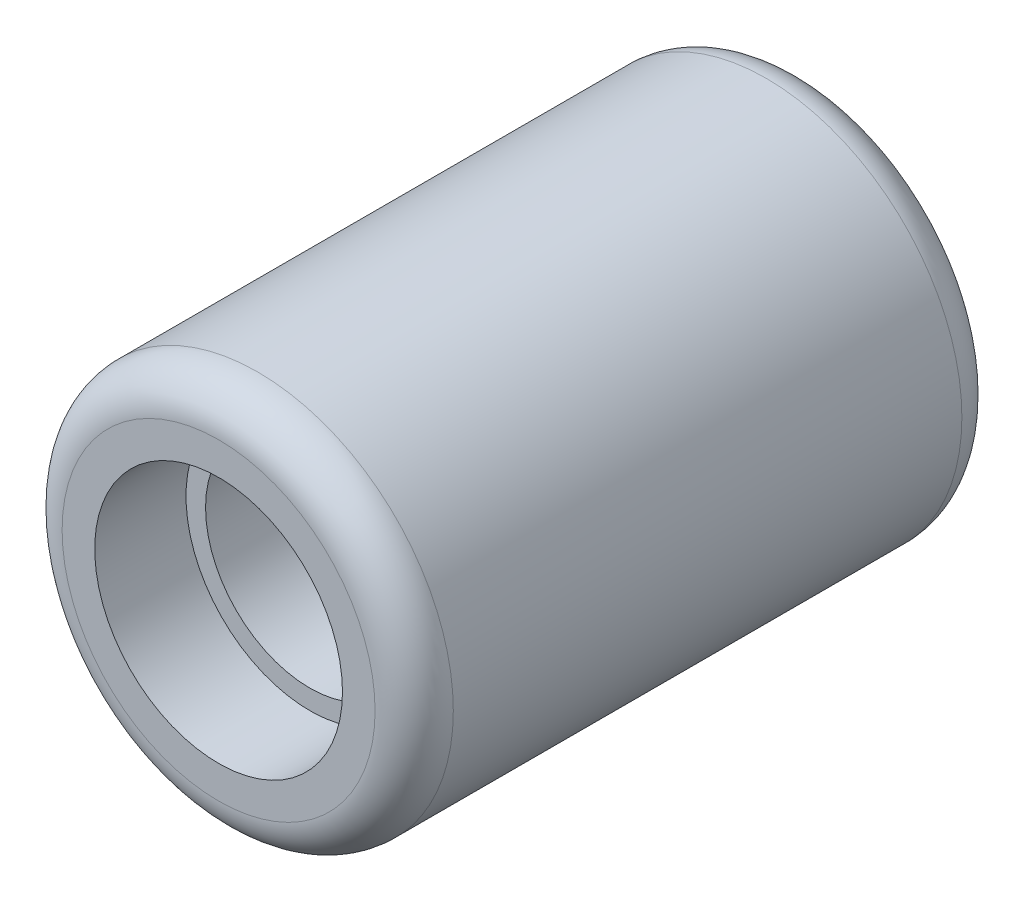
ISO-10303-21;
HEADER;
FILE_DESCRIPTION(('STEP AP214'),'2;1');
FILE_NAME('part.step','',(''),(''),'','','');
FILE_SCHEMA(('AUTOMOTIVE_DESIGN { 1 0 10303 214 1 1 1 1 }'));
ENDSEC;
DATA;
#1=APPLICATION_CONTEXT('core data for automotive mechanical design processes');
#2=APPLICATION_PROTOCOL_DEFINITION('international standard','automotive_design',2000,#1);
#3=PRODUCT_CONTEXT('',#1,'mechanical');
#4=PRODUCT('Part','Part','',(#3));
#5=PRODUCT_RELATED_PRODUCT_CATEGORY('part','',(#4));
#6=PRODUCT_DEFINITION_FORMATION('','',#4);
#7=PRODUCT_DEFINITION_CONTEXT('part definition',#1,'design');
#8=PRODUCT_DEFINITION('design','',#6,#7);
#9=PRODUCT_DEFINITION_SHAPE('','',#8);
#10=(LENGTH_UNIT() NAMED_UNIT(*) SI_UNIT(.MILLI.,.METRE.));
#11=(NAMED_UNIT(*) PLANE_ANGLE_UNIT() SI_UNIT($,.RADIAN.));
#12=(NAMED_UNIT(*) SI_UNIT($,.STERADIAN.) SOLID_ANGLE_UNIT());
#13=UNCERTAINTY_MEASURE_WITH_UNIT(LENGTH_MEASURE(1.E-05),#10,'distance_accuracy_value','');
#14=(GEOMETRIC_REPRESENTATION_CONTEXT(3) GLOBAL_UNCERTAINTY_ASSIGNED_CONTEXT((#13)) GLOBAL_UNIT_ASSIGNED_CONTEXT((#10,
#11,#12)) REPRESENTATION_CONTEXT('',''));
#15=CARTESIAN_POINT('',(0.,0.,0.));
#16=DIRECTION('',(0.,0.,1.));
#17=DIRECTION('',(1.,0.,0.));
#18=AXIS2_PLACEMENT_3D('',#15,#16,#17);
#19=CARTESIAN_POINT('',(0.,0.,45.));
#20=DIRECTION('',(0.,0.,-1.));
#21=DIRECTION('',(-1.,0.,0.));
#22=AXIS2_PLACEMENT_3D('',#19,#20,#21);
#23=CYLINDRICAL_SURFACE('',#22,15.);
#24=CARTESIAN_POINT('',(0.,0.,42.));
#25=DIRECTION('',(0.,0.,1.));
#26=DIRECTION('',(1.,0.,0.));
#27=AXIS2_PLACEMENT_3D('',#24,#25,#26);
#28=CIRCLE('',#27,15.);
#29=CARTESIAN_POINT('',(-15.,0.,42.));
#30=VERTEX_POINT('',#29);
#31=EDGE_CURVE('E51',#30,#30,#28,.F.);
#32=CARTESIAN_POINT('',(0.,0.,3.));
#33=DIRECTION('',(0.,0.,1.));
#34=DIRECTION('',(1.,0.,0.));
#35=AXIS2_PLACEMENT_3D('',#32,#33,#34);
#36=CIRCLE('',#35,15.);
#37=CARTESIAN_POINT('',(-15.,0.,3.));
#38=VERTEX_POINT('',#37);
#39=EDGE_CURVE('E56',#38,#38,#36,.T.);
#40=CARTESIAN_POINT('',(-15.,0.,42.));
#41=CARTESIAN_POINT('',(-15.,0.,41.59375));
#42=CARTESIAN_POINT('',(-15.,0.,41.1875));
#43=CARTESIAN_POINT('',(-15.,0.,40.375));
#44=CARTESIAN_POINT('',(-15.,0.,39.96875));
#45=CARTESIAN_POINT('',(-15.,0.,39.15625));
#46=CARTESIAN_POINT('',(-15.,0.,38.75));
#47=CARTESIAN_POINT('',(-15.,0.,37.9375));
#48=CARTESIAN_POINT('',(-15.,0.,37.53125));
#49=CARTESIAN_POINT('',(-15.,0.,36.71875));
#50=CARTESIAN_POINT('',(-15.,0.,36.3125));
#51=CARTESIAN_POINT('',(-15.,0.,35.5));
#52=CARTESIAN_POINT('',(-15.,0.,35.09375));
#53=CARTESIAN_POINT('',(-15.,0.,34.28125));
#54=CARTESIAN_POINT('',(-15.,0.,33.875));
#55=CARTESIAN_POINT('',(-15.,0.,33.0625));
#56=CARTESIAN_POINT('',(-15.,0.,32.65625));
#57=CARTESIAN_POINT('',(-15.,0.,31.84375));
#58=CARTESIAN_POINT('',(-15.,0.,31.4375));
#59=CARTESIAN_POINT('',(-15.,0.,30.625));
#60=CARTESIAN_POINT('',(-15.,0.,30.21875));
#61=CARTESIAN_POINT('',(-15.,0.,29.40625));
#62=CARTESIAN_POINT('',(-15.,0.,29.));
#63=CARTESIAN_POINT('',(-15.,0.,28.1875));
#64=CARTESIAN_POINT('',(-15.,0.,27.78125));
#65=CARTESIAN_POINT('',(-15.,0.,26.96875));
#66=CARTESIAN_POINT('',(-15.,0.,26.5625));
#67=CARTESIAN_POINT('',(-15.,0.,25.75));
#68=CARTESIAN_POINT('',(-15.,0.,25.34375));
#69=CARTESIAN_POINT('',(-15.,0.,24.53125));
#70=CARTESIAN_POINT('',(-15.,0.,24.125));
#71=CARTESIAN_POINT('',(-15.,0.,23.3125));
#72=CARTESIAN_POINT('',(-15.,0.,22.90625));
#73=CARTESIAN_POINT('',(-15.,0.,22.09375));
#74=CARTESIAN_POINT('',(-15.,0.,21.6875));
#75=CARTESIAN_POINT('',(-15.,0.,20.875));
#76=CARTESIAN_POINT('',(-15.,0.,20.46875));
#77=CARTESIAN_POINT('',(-15.,0.,19.65625));
#78=CARTESIAN_POINT('',(-15.,0.,19.25));
#79=CARTESIAN_POINT('',(-15.,0.,18.4375));
#80=CARTESIAN_POINT('',(-15.,0.,18.03125));
#81=CARTESIAN_POINT('',(-15.,0.,17.21875));
#82=CARTESIAN_POINT('',(-15.,0.,16.8125));
#83=CARTESIAN_POINT('',(-15.,0.,16.));
#84=CARTESIAN_POINT('',(-15.,0.,15.59375));
#85=CARTESIAN_POINT('',(-15.,0.,14.78125));
#86=CARTESIAN_POINT('',(-15.,0.,14.375));
#87=CARTESIAN_POINT('',(-15.,0.,13.5625));
#88=CARTESIAN_POINT('',(-15.,0.,13.15625));
#89=CARTESIAN_POINT('',(-15.,0.,12.34375));
#90=CARTESIAN_POINT('',(-15.,0.,11.9375));
#91=CARTESIAN_POINT('',(-15.,0.,11.125));
#92=CARTESIAN_POINT('',(-15.,0.,10.71875));
#93=CARTESIAN_POINT('',(-15.,0.,9.90625));
#94=CARTESIAN_POINT('',(-15.,0.,9.5));
#95=CARTESIAN_POINT('',(-15.,0.,8.6875));
#96=CARTESIAN_POINT('',(-15.,0.,8.28124999999999));
#97=CARTESIAN_POINT('',(-15.,0.,7.46874999999999));
#98=CARTESIAN_POINT('',(-15.,0.,7.06249999999999));
#99=CARTESIAN_POINT('',(-15.,0.,6.25));
#100=CARTESIAN_POINT('',(-15.,0.,5.84375));
#101=CARTESIAN_POINT('',(-15.,0.,5.03125));
#102=CARTESIAN_POINT('',(-15.,0.,4.625));
#103=CARTESIAN_POINT('',(-15.,0.,3.81249999999999));
#104=CARTESIAN_POINT('',(-15.,0.,3.40624999999999));
#105=CARTESIAN_POINT('',(-15.,0.,3.));
#106=B_SPLINE_CURVE_WITH_KNOTS('',3,(#40,#41,#42,#43,#44,#45,#46,#47,#48,#49,#50,#51,#52,#53,
#54,#55,#56,#57,#58,#59,#60,#61,#62,#63,#64,#65,#66,#67,#68,#69,#70,#71,#72,#73,#74,#75,#76,#77,
#78,#79,#80,#81,#82,#83,#84,#85,#86,#87,#88,#89,#90,#91,#92,#93,#94,#95,#96,#97,#98,#99,#100,
#101,#102,#103,#104,#105),.UNSPECIFIED.,.F.,.F.,(4,2,2,2,2,2,2,2,2,2,2,2,2,2,2,2,2,2,2,2,2,2,2,
2,2,2,2,2,2,2,2,2,4),(0.,1.21875,2.4375,3.65624999999999,4.875,6.09374999999999,
7.31249999999999,8.53125,9.74999999999999,10.96875,12.1875,13.40625,14.625,15.84375,17.0625,
18.28125,19.5,20.71875,21.9375,23.15625,24.375,25.59375,26.8125,28.03125,29.25,30.46875,31.6875,
32.90625,34.125,35.34375,36.5625,37.78125,39.),.UNSPECIFIED.);
#107=EDGE_CURVE('BSEAM43',#30,#38,#106,.T.);
#108=ORIENTED_EDGE('',*,*,#31,.T.);
#109=ORIENTED_EDGE('',*,*,#39,.T.);
#110=ORIENTED_EDGE('',*,*,#107,.T.);
#111=ORIENTED_EDGE('',*,*,#107,.F.);
#112=EDGE_LOOP('',(#108,#110,#109,#111));
#113=FACE_BOUND('',#112,.T.);
#114=ADVANCED_FACE('F43',(#113),#23,.T.);
#115=CARTESIAN_POINT('',(0.,0.,45.));
#116=DIRECTION('',(0.,0.,1.));
#117=DIRECTION('',(1.,0.,0.));
#118=AXIS2_PLACEMENT_3D('',#115,#116,#117);
#119=PLANE('',#118);
#120=CARTESIAN_POINT('',(0.,0.,45.));
#121=DIRECTION('',(0.,0.,1.));
#122=DIRECTION('',(1.,0.,0.));
#123=AXIS2_PLACEMENT_3D('',#120,#121,#122);
#124=CIRCLE('',#123,12.);
#125=CARTESIAN_POINT('',(12.,0.,45.));
#126=VERTEX_POINT('',#125);
#127=EDGE_CURVE('E61',#126,#126,#124,.T.);
#128=ORIENTED_EDGE('',*,*,#127,.T.);
#129=EDGE_LOOP('',(#128));
#130=FACE_BOUND('',#129,.T.);
#131=CARTESIAN_POINT('',(0.,0.,45.));
#132=DIRECTION('',(0.,0.,1.));
#133=DIRECTION('',(1.,0.,0.));
#134=AXIS2_PLACEMENT_3D('',#131,#132,#133);
#135=CIRCLE('',#134,9.5);
#136=CARTESIAN_POINT('',(9.5,0.,45.));
#137=VERTEX_POINT('',#136);
#138=EDGE_CURVE('E74',#137,#137,#135,.T.);
#139=ORIENTED_EDGE('',*,*,#138,.F.);
#140=EDGE_LOOP('',(#139));
#141=FACE_BOUND('',#140,.T.);
#142=ADVANCED_FACE('F110',(#130,#141),#119,.T.);
#143=CARTESIAN_POINT('',(0.,0.,0.));
#144=DIRECTION('',(0.,0.,1.));
#145=DIRECTION('',(1.,0.,0.));
#146=AXIS2_PLACEMENT_3D('',#143,#144,#145);
#147=PLANE('',#146);
#148=CARTESIAN_POINT('',(0.,0.,0.));
#149=DIRECTION('',(0.,0.,1.));
#150=DIRECTION('',(1.,0.,0.));
#151=AXIS2_PLACEMENT_3D('',#148,#149,#150);
#152=CIRCLE('',#151,12.);
#153=CARTESIAN_POINT('',(12.,0.,0.));
#154=VERTEX_POINT('',#153);
#155=EDGE_CURVE('E10',#154,#154,#152,.F.);
#156=ORIENTED_EDGE('',*,*,#155,.T.);
#157=EDGE_LOOP('',(#156));
#158=FACE_BOUND('',#157,.T.);
#159=CARTESIAN_POINT('',(0.,0.,0.));
#160=DIRECTION('',(0.,0.,-1.));
#161=DIRECTION('',(-1.,0.,0.));
#162=AXIS2_PLACEMENT_3D('',#159,#160,#161);
#163=CIRCLE('',#162,9.5);
#164=CARTESIAN_POINT('',(-9.5,0.,0.));
#165=VERTEX_POINT('',#164);
#166=EDGE_CURVE('E72',#165,#165,#163,.T.);
#167=ORIENTED_EDGE('',*,*,#166,.F.);
#168=EDGE_LOOP('',(#167));
#169=FACE_BOUND('',#168,.T.);
#170=ADVANCED_FACE('F107',(#158,#169),#147,.F.);
#171=CARTESIAN_POINT('',(0.,0.,38.));
#172=DIRECTION('',(0.,0.,1.));
#173=DIRECTION('',(1.,0.,0.));
#174=AXIS2_PLACEMENT_3D('',#171,#172,#173);
#175=CYLINDRICAL_SURFACE('',#174,9.5);
#176=CARTESIAN_POINT('',(0.,0.,38.));
#177=DIRECTION('',(0.,0.,1.));
#178=DIRECTION('',(1.,0.,0.));
#179=AXIS2_PLACEMENT_3D('',#176,#177,#178);
#180=CIRCLE('',#179,9.5);
#181=CARTESIAN_POINT('',(9.5,0.,38.));
#182=VERTEX_POINT('',#181);
#183=EDGE_CURVE('E67',#182,#182,#180,.T.);
#184=ORIENTED_EDGE('',*,*,#183,.F.);
#185=EDGE_LOOP('',(#184));
#186=FACE_BOUND('',#185,.T.);
#187=ORIENTED_EDGE('',*,*,#138,.T.);
#188=EDGE_LOOP('',(#187));
#189=FACE_BOUND('',#188,.T.);
#190=ADVANCED_FACE('F109',(#186,#189),#175,.F.);
#191=CARTESIAN_POINT('',(0.,0.,38.));
#192=DIRECTION('',(0.,0.,1.));
#193=DIRECTION('',(1.,0.,0.));
#194=AXIS2_PLACEMENT_3D('',#191,#192,#193);
#195=PLANE('',#194);
#196=CARTESIAN_POINT('',(0.,0.,38.));
#197=DIRECTION('',(0.,0.,1.));
#198=DIRECTION('',(1.,0.,0.));
#199=AXIS2_PLACEMENT_3D('',#196,#197,#198);
#200=CIRCLE('',#199,8.);
#201=CARTESIAN_POINT('',(8.,0.,38.));
#202=VERTEX_POINT('',#201);
#203=EDGE_CURVE('E68',#202,#202,#200,.T.);
#204=ORIENTED_EDGE('',*,*,#203,.F.);
#205=EDGE_LOOP('',(#204));
#206=FACE_BOUND('',#205,.T.);
#207=ORIENTED_EDGE('',*,*,#183,.T.);
#208=EDGE_LOOP('',(#207));
#209=FACE_BOUND('',#208,.T.);
#210=ADVANCED_FACE('F103',(#206,#209),#195,.T.);
#211=CARTESIAN_POINT('',(0.,0.,7.));
#212=DIRECTION('',(0.,0.,-1.));
#213=DIRECTION('',(-1.,0.,0.));
#214=AXIS2_PLACEMENT_3D('',#211,#212,#213);
#215=CYLINDRICAL_SURFACE('',#214,9.5);
#216=CARTESIAN_POINT('',(0.,0.,7.));
#217=DIRECTION('',(0.,0.,-1.));
#218=DIRECTION('',(-1.,0.,0.));
#219=AXIS2_PLACEMENT_3D('',#216,#217,#218);
#220=CIRCLE('',#219,9.5);
#221=CARTESIAN_POINT('',(-9.5,0.,7.));
#222=VERTEX_POINT('',#221);
#223=EDGE_CURVE('E78',#222,#222,#220,.T.);
#224=ORIENTED_EDGE('',*,*,#223,.F.);
#225=EDGE_LOOP('',(#224));
#226=FACE_BOUND('',#225,.T.);
#227=ORIENTED_EDGE('',*,*,#166,.T.);
#228=EDGE_LOOP('',(#227));
#229=FACE_BOUND('',#228,.T.);
#230=ADVANCED_FACE('F97',(#226,#229),#215,.F.);
#231=CARTESIAN_POINT('',(0.,0.,7.));
#232=DIRECTION('',(0.,0.,-1.));
#233=DIRECTION('',(-1.,0.,0.));
#234=AXIS2_PLACEMENT_3D('',#231,#232,#233);
#235=PLANE('',#234);
#236=CARTESIAN_POINT('',(0.,0.,7.));
#237=DIRECTION('',(0.,0.,-1.));
#238=DIRECTION('',(-1.,0.,0.));
#239=AXIS2_PLACEMENT_3D('',#236,#237,#238);
#240=CIRCLE('',#239,8.);
#241=CARTESIAN_POINT('',(-8.,0.,7.));
#242=VERTEX_POINT('',#241);
#243=EDGE_CURVE('E73',#242,#242,#240,.T.);
#244=ORIENTED_EDGE('',*,*,#243,.F.);
#245=EDGE_LOOP('',(#244));
#246=FACE_BOUND('',#245,.T.);
#247=ORIENTED_EDGE('',*,*,#223,.T.);
#248=EDGE_LOOP('',(#247));
#249=FACE_BOUND('',#248,.T.);
#250=ADVANCED_FACE('F94',(#246,#249),#235,.T.);
#251=CARTESIAN_POINT('',(0.,0.,67.));
#252=DIRECTION('',(0.,0.,-1.));
#253=DIRECTION('',(-1.,0.,0.));
#254=AXIS2_PLACEMENT_3D('',#251,#252,#253);
#255=CYLINDRICAL_SURFACE('',#254,8.);
#256=ORIENTED_EDGE('',*,*,#203,.T.);
#257=EDGE_LOOP('',(#256));
#258=FACE_BOUND('',#257,.T.);
#259=ORIENTED_EDGE('',*,*,#243,.T.);
#260=EDGE_LOOP('',(#259));
#261=FACE_BOUND('',#260,.T.);
#262=ADVANCED_FACE('F92',(#258,#261),#255,.F.);
#263=CARTESIAN_POINT('',(0.,0.,42.));
#264=DIRECTION('',(0.,0.,1.));
#265=DIRECTION('',(1.,0.,0.));
#266=AXIS2_PLACEMENT_3D('',#263,#264,#265);
#267=TOROIDAL_SURFACE('',#266,12.,3.);
#268=ORIENTED_EDGE('',*,*,#31,.F.);
#269=EDGE_LOOP('',(#268));
#270=FACE_BOUND('',#269,.T.);
#271=ORIENTED_EDGE('',*,*,#127,.F.);
#272=EDGE_LOOP('',(#271));
#273=FACE_BOUND('',#272,.T.);
#274=ADVANCED_FACE('F125',(#270,#273),#267,.T.);
#275=CARTESIAN_POINT('',(0.,0.,3.));
#276=DIRECTION('',(0.,0.,1.));
#277=DIRECTION('',(1.,0.,0.));
#278=AXIS2_PLACEMENT_3D('',#275,#276,#277);
#279=TOROIDAL_SURFACE('',#278,12.,3.);
#280=ORIENTED_EDGE('',*,*,#155,.F.);
#281=EDGE_LOOP('',(#280));
#282=FACE_BOUND('',#281,.T.);
#283=ORIENTED_EDGE('',*,*,#39,.F.);
#284=EDGE_LOOP('',(#283));
#285=FACE_BOUND('',#284,.T.);
#286=ADVANCED_FACE('F45',(#282,#285),#279,.T.);
#287=CLOSED_SHELL('',(#114,#142,#170,#190,#210,#230,#250,#262,#274,#286));
#288=MANIFOLD_SOLID_BREP('B2',#287);
#289=ADVANCED_BREP_SHAPE_REPRESENTATION('',(#18,#288),#14);
#290=SHAPE_DEFINITION_REPRESENTATION(#9,#289);
ENDSEC;
END-ISO-10303-21;
